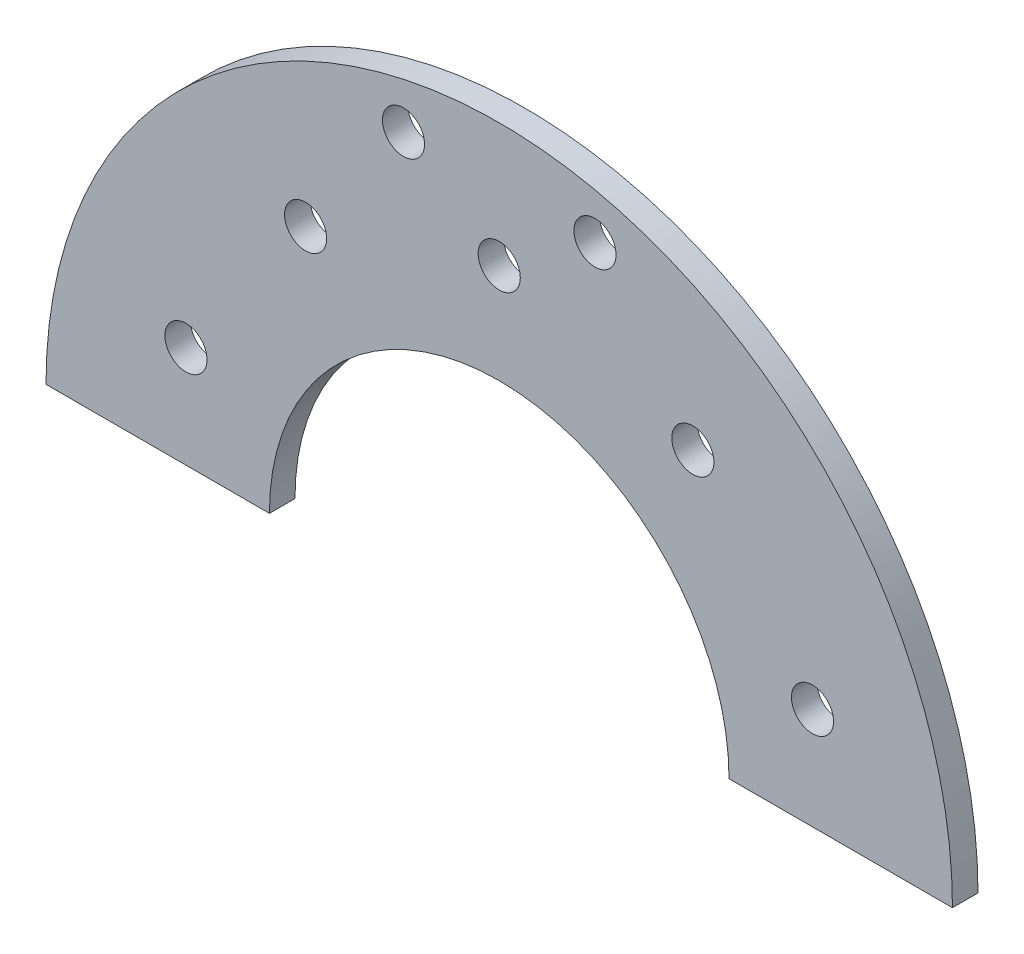
ISO-10303-21;
HEADER;
FILE_DESCRIPTION(('STEP AP214'),'2;1');
FILE_NAME('part.step','',(''),(''),'','','');
FILE_SCHEMA(('AUTOMOTIVE_DESIGN { 1 0 10303 214 1 1 1 1 }'));
ENDSEC;
DATA;
#1=APPLICATION_CONTEXT('core data for automotive mechanical design processes');
#2=APPLICATION_PROTOCOL_DEFINITION('international standard','automotive_design',2000,#1);
#3=PRODUCT_CONTEXT('',#1,'mechanical');
#4=PRODUCT('Part','Part','',(#3));
#5=PRODUCT_RELATED_PRODUCT_CATEGORY('part','',(#4));
#6=PRODUCT_DEFINITION_FORMATION('','',#4);
#7=PRODUCT_DEFINITION_CONTEXT('part definition',#1,'design');
#8=PRODUCT_DEFINITION('design','',#6,#7);
#9=PRODUCT_DEFINITION_SHAPE('','',#8);
#10=(LENGTH_UNIT() NAMED_UNIT(*) SI_UNIT(.MILLI.,.METRE.));
#11=(NAMED_UNIT(*) PLANE_ANGLE_UNIT() SI_UNIT($,.RADIAN.));
#12=(NAMED_UNIT(*) SI_UNIT($,.STERADIAN.) SOLID_ANGLE_UNIT());
#13=UNCERTAINTY_MEASURE_WITH_UNIT(LENGTH_MEASURE(1.E-05),#10,'distance_accuracy_value','');
#14=(GEOMETRIC_REPRESENTATION_CONTEXT(3) GLOBAL_UNCERTAINTY_ASSIGNED_CONTEXT((#13)) GLOBAL_UNIT_ASSIGNED_CONTEXT((#10,
#11,#12)) REPRESENTATION_CONTEXT('',''));
#15=CARTESIAN_POINT('',(0.,0.,0.));
#16=DIRECTION('',(0.,0.,1.));
#17=DIRECTION('',(1.,0.,0.));
#18=AXIS2_PLACEMENT_3D('',#15,#16,#17);
#19=CARTESIAN_POINT('',(0.,0.,0.));
#20=DIRECTION('',(0.,1.,0.));
#21=DIRECTION('',(0.,0.,1.));
#22=AXIS2_PLACEMENT_3D('',#19,#20,#21);
#23=PLANE('',#22);
#24=DIRECTION('',(-1.,0.,0.));
#25=VECTOR('',#24,1.);
#26=CARTESIAN_POINT('',(0.,0.,4.));
#27=LINE('',#26,#25);
#28=CARTESIAN_POINT('',(71.,0.,4.));
#29=VERTEX_POINT('',#28);
#30=CARTESIAN_POINT('',(36.,0.,4.));
#31=VERTEX_POINT('',#30);
#32=EDGE_CURVE('E77',#29,#31,#27,.T.);
#33=ORIENTED_EDGE('',*,*,#32,.T.);
#34=DIRECTION('',(0.,0.,-1.));
#35=VECTOR('',#34,1.);
#36=CARTESIAN_POINT('',(36.,0.,4.));
#37=LINE('',#36,#35);
#38=CARTESIAN_POINT('',(36.,0.,0.));
#39=VERTEX_POINT('',#38);
#40=EDGE_CURVE('E41',#31,#39,#37,.T.);
#41=ORIENTED_EDGE('',*,*,#40,.T.);
#42=DIRECTION('',(-1.,0.,0.));
#43=VECTOR('',#42,1.);
#44=CARTESIAN_POINT('',(0.,0.,0.));
#45=LINE('',#44,#43);
#46=CARTESIAN_POINT('',(71.,0.,0.));
#47=VERTEX_POINT('',#46);
#48=EDGE_CURVE('E78',#47,#39,#45,.T.);
#49=ORIENTED_EDGE('',*,*,#48,.F.);
#50=DIRECTION('',(0.,0.,-1.));
#51=VECTOR('',#50,1.);
#52=CARTESIAN_POINT('',(71.,0.,4.));
#53=LINE('',#52,#51);
#54=EDGE_CURVE('E36',#29,#47,#53,.T.);
#55=ORIENTED_EDGE('',*,*,#54,.F.);
#56=EDGE_LOOP('',(#33,#41,#49,#55));
#57=FACE_BOUND('',#56,.T.);
#58=ADVANCED_FACE('F33',(#57),#23,.F.);
#59=CARTESIAN_POINT('',(-36.,0.,0.));
#60=VERTEX_POINT('',#59);
#61=CARTESIAN_POINT('',(-71.,0.,0.));
#62=VERTEX_POINT('',#61);
#63=EDGE_CURVE('E83',#60,#62,#45,.T.);
#64=ORIENTED_EDGE('',*,*,#63,.F.);
#65=DIRECTION('',(0.,0.,-1.));
#66=VECTOR('',#65,1.);
#67=CARTESIAN_POINT('',(-36.,0.,4.));
#68=LINE('',#67,#66);
#69=CARTESIAN_POINT('',(-36.,0.,4.));
#70=VERTEX_POINT('',#69);
#71=EDGE_CURVE('E11',#60,#70,#68,.F.);
#72=ORIENTED_EDGE('',*,*,#71,.T.);
#73=CARTESIAN_POINT('',(-71.,0.,4.));
#74=VERTEX_POINT('',#73);
#75=EDGE_CURVE('E56',#70,#74,#27,.T.);
#76=ORIENTED_EDGE('',*,*,#75,.T.);
#77=DIRECTION('',(0.,0.,-1.));
#78=VECTOR('',#77,1.);
#79=CARTESIAN_POINT('',(-71.,0.,4.));
#80=LINE('',#79,#78);
#81=EDGE_CURVE('E84',#62,#74,#80,.F.);
#82=ORIENTED_EDGE('',*,*,#81,.F.);
#83=EDGE_LOOP('',(#64,#72,#76,#82));
#84=FACE_BOUND('',#83,.T.);
#85=ADVANCED_FACE('F101',(#84),#23,.F.);
#86=CARTESIAN_POINT('',(0.,0.,4.));
#87=DIRECTION('',(0.,0.,1.));
#88=DIRECTION('',(1.,0.,0.));
#89=AXIS2_PLACEMENT_3D('',#86,#87,#88);
#90=PLANE('',#89);
#91=ORIENTED_EDGE('',*,*,#32,.F.);
#92=CARTESIAN_POINT('',(0.,0.,4.));
#93=DIRECTION('',(0.,0.,1.));
#94=DIRECTION('',(1.,0.,0.));
#95=AXIS2_PLACEMENT_3D('',#92,#93,#94);
#96=CIRCLE('',#95,71.);
#97=EDGE_CURVE('E87',#29,#74,#96,.T.);
#98=ORIENTED_EDGE('',*,*,#97,.T.);
#99=ORIENTED_EDGE('',*,*,#75,.F.);
#100=CARTESIAN_POINT('',(0.,0.,4.));
#101=DIRECTION('',(0.,0.,1.));
#102=DIRECTION('',(1.,0.,0.));
#103=AXIS2_PLACEMENT_3D('',#100,#101,#102);
#104=CIRCLE('',#103,36.);
#105=EDGE_CURVE('E88',#31,#70,#104,.T.);
#106=ORIENTED_EDGE('',*,*,#105,.F.);
#107=EDGE_LOOP('',(#91,#98,#99,#106));
#108=FACE_BOUND('',#107,.T.);
#109=CARTESIAN_POINT('',(-15.,62.2173609212091,4.));
#110=DIRECTION('',(0.,0.,1.));
#111=DIRECTION('',(1.,0.,0.));
#112=AXIS2_PLACEMENT_3D('',#109,#110,#111);
#113=CIRCLE('',#112,3.3);
#114=CARTESIAN_POINT('',(-11.7,62.2173609212091,4.));
#115=VERTEX_POINT('',#114);
#116=EDGE_CURVE('E134',#115,#115,#113,.T.);
#117=ORIENTED_EDGE('',*,*,#116,.F.);
#118=EDGE_LOOP('',(#117));
#119=FACE_BOUND('',#118,.T.);
#120=CARTESIAN_POINT('',(-49.0745162408298,15.9452769097478,4.));
#121=DIRECTION('',(0.,0.,1.));
#122=DIRECTION('',(1.,0.,0.));
#123=AXIS2_PLACEMENT_3D('',#120,#121,#122);
#124=CIRCLE('',#123,3.30000000000029);
#125=CARTESIAN_POINT('',(-45.7745162408295,15.9452769097478,4.));
#126=VERTEX_POINT('',#125);
#127=EDGE_CURVE('E122',#126,#126,#124,.T.);
#128=ORIENTED_EDGE('',*,*,#127,.F.);
#129=EDGE_LOOP('',(#128));
#130=FACE_BOUND('',#129,.T.);
#131=CARTESIAN_POINT('',(49.0745162408302,15.9452769097465,4.));
#132=DIRECTION('',(0.,0.,1.));
#133=DIRECTION('',(1.,0.,0.));
#134=AXIS2_PLACEMENT_3D('',#131,#132,#133);
#135=CIRCLE('',#134,3.3);
#136=CARTESIAN_POINT('',(52.3745162408302,15.9452769097465,4.));
#137=VERTEX_POINT('',#136);
#138=EDGE_CURVE('E116',#137,#137,#135,.T.);
#139=ORIENTED_EDGE('',*,*,#138,.F.);
#140=EDGE_LOOP('',(#139));
#141=FACE_BOUND('',#140,.T.);
#142=CARTESIAN_POINT('',(0.,51.6,4.));
#143=DIRECTION('',(0.,0.,1.));
#144=DIRECTION('',(1.,0.,0.));
#145=AXIS2_PLACEMENT_3D('',#142,#143,#144);
#146=CIRCLE('',#145,3.3);
#147=CARTESIAN_POINT('',(3.3,51.6,4.));
#148=VERTEX_POINT('',#147);
#149=EDGE_CURVE('E105',#148,#148,#146,.T.);
#150=ORIENTED_EDGE('',*,*,#149,.F.);
#151=EDGE_LOOP('',(#150));
#152=FACE_BOUND('',#151,.T.);
#153=CARTESIAN_POINT('',(30.3297190182922,41.7452769097468,4.));
#154=DIRECTION('',(0.,0.,1.));
#155=DIRECTION('',(1.,0.,0.));
#156=AXIS2_PLACEMENT_3D('',#153,#154,#155);
#157=CIRCLE('',#156,3.3);
#158=CARTESIAN_POINT('',(33.6297190182922,41.7452769097468,4.));
#159=VERTEX_POINT('',#158);
#160=EDGE_CURVE('E110',#159,#159,#157,.T.);
#161=ORIENTED_EDGE('',*,*,#160,.F.);
#162=EDGE_LOOP('',(#161));
#163=FACE_BOUND('',#162,.T.);
#164=CARTESIAN_POINT('',(-30.3297190182911,41.7452769097477,4.));
#165=DIRECTION('',(0.,0.,1.));
#166=DIRECTION('',(1.,0.,0.));
#167=AXIS2_PLACEMENT_3D('',#164,#165,#166);
#168=CIRCLE('',#167,3.30000000000001);
#169=CARTESIAN_POINT('',(-27.0297190182911,41.7452769097477,4.));
#170=VERTEX_POINT('',#169);
#171=EDGE_CURVE('E128',#170,#170,#168,.T.);
#172=ORIENTED_EDGE('',*,*,#171,.F.);
#173=EDGE_LOOP('',(#172));
#174=FACE_BOUND('',#173,.T.);
#175=CARTESIAN_POINT('',(15.,62.2173609212091,4.));
#176=DIRECTION('',(0.,0.,1.));
#177=DIRECTION('',(1.,0.,0.));
#178=AXIS2_PLACEMENT_3D('',#175,#176,#177);
#179=CIRCLE('',#178,3.3);
#180=CARTESIAN_POINT('',(18.3,62.2173609212091,4.));
#181=VERTEX_POINT('',#180);
#182=EDGE_CURVE('E140',#181,#181,#179,.T.);
#183=ORIENTED_EDGE('',*,*,#182,.F.);
#184=EDGE_LOOP('',(#183));
#185=FACE_BOUND('',#184,.T.);
#186=ADVANCED_FACE('F85',(#108,#119,#130,#141,#152,#163,#174,#185),#90,.T.);
#187=CARTESIAN_POINT('',(0.,0.,0.));
#188=DIRECTION('',(0.,0.,1.));
#189=DIRECTION('',(1.,0.,0.));
#190=AXIS2_PLACEMENT_3D('',#187,#188,#189);
#191=PLANE('',#190);
#192=CARTESIAN_POINT('',(0.,0.,0.));
#193=DIRECTION('',(0.,0.,1.));
#194=DIRECTION('',(1.,0.,0.));
#195=AXIS2_PLACEMENT_3D('',#192,#193,#194);
#196=CIRCLE('',#195,71.);
#197=EDGE_CURVE('E91',#47,#62,#196,.T.);
#198=ORIENTED_EDGE('',*,*,#197,.F.);
#199=ORIENTED_EDGE('',*,*,#48,.T.);
#200=CARTESIAN_POINT('',(0.,0.,0.));
#201=DIRECTION('',(0.,0.,1.));
#202=DIRECTION('',(1.,0.,0.));
#203=AXIS2_PLACEMENT_3D('',#200,#201,#202);
#204=CIRCLE('',#203,36.);
#205=EDGE_CURVE('E95',#39,#60,#204,.T.);
#206=ORIENTED_EDGE('',*,*,#205,.T.);
#207=ORIENTED_EDGE('',*,*,#63,.T.);
#208=EDGE_LOOP('',(#198,#199,#206,#207));
#209=FACE_BOUND('',#208,.T.);
#210=CARTESIAN_POINT('',(0.,51.6,0.));
#211=DIRECTION('',(0.,0.,1.));
#212=DIRECTION('',(1.,0.,0.));
#213=AXIS2_PLACEMENT_3D('',#210,#211,#212);
#214=CIRCLE('',#213,3.3);
#215=CARTESIAN_POINT('',(3.3,51.6,0.));
#216=VERTEX_POINT('',#215);
#217=EDGE_CURVE('E107',#216,#216,#214,.T.);
#218=ORIENTED_EDGE('',*,*,#217,.T.);
#219=EDGE_LOOP('',(#218));
#220=FACE_BOUND('',#219,.T.);
#221=CARTESIAN_POINT('',(30.3297190182922,41.7452769097468,0.));
#222=DIRECTION('',(0.,0.,1.));
#223=DIRECTION('',(1.,0.,0.));
#224=AXIS2_PLACEMENT_3D('',#221,#222,#223);
#225=CIRCLE('',#224,3.3);
#226=CARTESIAN_POINT('',(33.6297190182922,41.7452769097468,0.));
#227=VERTEX_POINT('',#226);
#228=EDGE_CURVE('E113',#227,#227,#225,.T.);
#229=ORIENTED_EDGE('',*,*,#228,.T.);
#230=EDGE_LOOP('',(#229));
#231=FACE_BOUND('',#230,.T.);
#232=CARTESIAN_POINT('',(49.0745162408302,15.9452769097465,0.));
#233=DIRECTION('',(0.,0.,1.));
#234=DIRECTION('',(1.,0.,0.));
#235=AXIS2_PLACEMENT_3D('',#232,#233,#234);
#236=CIRCLE('',#235,3.3);
#237=CARTESIAN_POINT('',(52.3745162408302,15.9452769097465,0.));
#238=VERTEX_POINT('',#237);
#239=EDGE_CURVE('E119',#238,#238,#236,.T.);
#240=ORIENTED_EDGE('',*,*,#239,.T.);
#241=EDGE_LOOP('',(#240));
#242=FACE_BOUND('',#241,.T.);
#243=CARTESIAN_POINT('',(-49.0745162408298,15.9452769097478,0.));
#244=DIRECTION('',(0.,0.,1.));
#245=DIRECTION('',(1.,0.,0.));
#246=AXIS2_PLACEMENT_3D('',#243,#244,#245);
#247=CIRCLE('',#246,3.30000000000029);
#248=CARTESIAN_POINT('',(-45.7745162408295,15.9452769097478,0.));
#249=VERTEX_POINT('',#248);
#250=EDGE_CURVE('E125',#249,#249,#247,.T.);
#251=ORIENTED_EDGE('',*,*,#250,.T.);
#252=EDGE_LOOP('',(#251));
#253=FACE_BOUND('',#252,.T.);
#254=CARTESIAN_POINT('',(-30.3297190182911,41.7452769097477,0.));
#255=DIRECTION('',(0.,0.,1.));
#256=DIRECTION('',(1.,0.,0.));
#257=AXIS2_PLACEMENT_3D('',#254,#255,#256);
#258=CIRCLE('',#257,3.30000000000001);
#259=CARTESIAN_POINT('',(-27.0297190182911,41.7452769097477,0.));
#260=VERTEX_POINT('',#259);
#261=EDGE_CURVE('E131',#260,#260,#258,.T.);
#262=ORIENTED_EDGE('',*,*,#261,.T.);
#263=EDGE_LOOP('',(#262));
#264=FACE_BOUND('',#263,.T.);
#265=CARTESIAN_POINT('',(-15.,62.2173609212091,0.));
#266=DIRECTION('',(0.,0.,1.));
#267=DIRECTION('',(1.,0.,0.));
#268=AXIS2_PLACEMENT_3D('',#265,#266,#267);
#269=CIRCLE('',#268,3.3);
#270=CARTESIAN_POINT('',(-11.7,62.2173609212091,0.));
#271=VERTEX_POINT('',#270);
#272=EDGE_CURVE('E137',#271,#271,#269,.T.);
#273=ORIENTED_EDGE('',*,*,#272,.T.);
#274=EDGE_LOOP('',(#273));
#275=FACE_BOUND('',#274,.T.);
#276=CARTESIAN_POINT('',(15.,62.2173609212091,0.));
#277=DIRECTION('',(0.,0.,1.));
#278=DIRECTION('',(1.,0.,0.));
#279=AXIS2_PLACEMENT_3D('',#276,#277,#278);
#280=CIRCLE('',#279,3.3);
#281=CARTESIAN_POINT('',(18.3,62.2173609212091,0.));
#282=VERTEX_POINT('',#281);
#283=EDGE_CURVE('E143',#282,#282,#280,.T.);
#284=ORIENTED_EDGE('',*,*,#283,.T.);
#285=EDGE_LOOP('',(#284));
#286=FACE_BOUND('',#285,.T.);
#287=ADVANCED_FACE('F153',(#209,#220,#231,#242,#253,#264,#275,#286),#191,.F.);
#288=CARTESIAN_POINT('',(0.,0.,4.));
#289=DIRECTION('',(0.,0.,-1.));
#290=DIRECTION('',(-1.,0.,0.));
#291=AXIS2_PLACEMENT_3D('',#288,#289,#290);
#292=CYLINDRICAL_SURFACE('',#291,71.);
#293=ORIENTED_EDGE('',*,*,#97,.F.);
#294=ORIENTED_EDGE('',*,*,#54,.T.);
#295=ORIENTED_EDGE('',*,*,#197,.T.);
#296=ORIENTED_EDGE('',*,*,#81,.T.);
#297=EDGE_LOOP('',(#293,#294,#295,#296));
#298=FACE_BOUND('',#297,.T.);
#299=ADVANCED_FACE('F90',(#298),#292,.T.);
#300=CARTESIAN_POINT('',(0.,0.,4.));
#301=DIRECTION('',(0.,0.,-1.));
#302=DIRECTION('',(-1.,0.,0.));
#303=AXIS2_PLACEMENT_3D('',#300,#301,#302);
#304=CYLINDRICAL_SURFACE('',#303,36.);
#305=ORIENTED_EDGE('',*,*,#40,.F.);
#306=ORIENTED_EDGE('',*,*,#105,.T.);
#307=ORIENTED_EDGE('',*,*,#71,.F.);
#308=ORIENTED_EDGE('',*,*,#205,.F.);
#309=EDGE_LOOP('',(#305,#306,#307,#308));
#310=FACE_BOUND('',#309,.T.);
#311=ADVANCED_FACE('F104',(#310),#304,.F.);
#312=CARTESIAN_POINT('',(0.,51.6,4.));
#313=DIRECTION('',(0.,0.,-1.));
#314=DIRECTION('',(-1.,0.,0.));
#315=AXIS2_PLACEMENT_3D('',#312,#313,#314);
#316=CYLINDRICAL_SURFACE('',#315,3.3);
#317=ORIENTED_EDGE('',*,*,#149,.T.);
#318=EDGE_LOOP('',(#317));
#319=FACE_BOUND('',#318,.T.);
#320=ORIENTED_EDGE('',*,*,#217,.F.);
#321=EDGE_LOOP('',(#320));
#322=FACE_BOUND('',#321,.T.);
#323=ADVANCED_FACE('F195',(#319,#322),#316,.F.);
#324=CARTESIAN_POINT('',(30.3297190182922,41.7452769097468,4.));
#325=DIRECTION('',(0.,0.,-1.));
#326=DIRECTION('',(-1.,0.,0.));
#327=AXIS2_PLACEMENT_3D('',#324,#325,#326);
#328=CYLINDRICAL_SURFACE('',#327,3.3);
#329=ORIENTED_EDGE('',*,*,#160,.T.);
#330=EDGE_LOOP('',(#329));
#331=FACE_BOUND('',#330,.T.);
#332=ORIENTED_EDGE('',*,*,#228,.F.);
#333=EDGE_LOOP('',(#332));
#334=FACE_BOUND('',#333,.T.);
#335=ADVANCED_FACE('F203',(#331,#334),#328,.F.);
#336=CARTESIAN_POINT('',(49.0745162408302,15.9452769097465,4.));
#337=DIRECTION('',(0.,0.,-1.));
#338=DIRECTION('',(-1.,0.,0.));
#339=AXIS2_PLACEMENT_3D('',#336,#337,#338);
#340=CYLINDRICAL_SURFACE('',#339,3.3);
#341=ORIENTED_EDGE('',*,*,#138,.T.);
#342=EDGE_LOOP('',(#341));
#343=FACE_BOUND('',#342,.T.);
#344=ORIENTED_EDGE('',*,*,#239,.F.);
#345=EDGE_LOOP('',(#344));
#346=FACE_BOUND('',#345,.T.);
#347=ADVANCED_FACE('F211',(#343,#346),#340,.F.);
#348=CARTESIAN_POINT('',(-49.0745162408298,15.9452769097478,4.));
#349=DIRECTION('',(0.,0.,-1.));
#350=DIRECTION('',(-1.,0.,0.));
#351=AXIS2_PLACEMENT_3D('',#348,#349,#350);
#352=CYLINDRICAL_SURFACE('',#351,3.30000000000029);
#353=ORIENTED_EDGE('',*,*,#127,.T.);
#354=EDGE_LOOP('',(#353));
#355=FACE_BOUND('',#354,.T.);
#356=ORIENTED_EDGE('',*,*,#250,.F.);
#357=EDGE_LOOP('',(#356));
#358=FACE_BOUND('',#357,.T.);
#359=ADVANCED_FACE('F220',(#355,#358),#352,.F.);
#360=CARTESIAN_POINT('',(-30.3297190182911,41.7452769097477,4.));
#361=DIRECTION('',(0.,0.,-1.));
#362=DIRECTION('',(-1.,0.,0.));
#363=AXIS2_PLACEMENT_3D('',#360,#361,#362);
#364=CYLINDRICAL_SURFACE('',#363,3.30000000000001);
#365=ORIENTED_EDGE('',*,*,#171,.T.);
#366=EDGE_LOOP('',(#365));
#367=FACE_BOUND('',#366,.T.);
#368=ORIENTED_EDGE('',*,*,#261,.F.);
#369=EDGE_LOOP('',(#368));
#370=FACE_BOUND('',#369,.T.);
#371=ADVANCED_FACE('F229',(#367,#370),#364,.F.);
#372=CARTESIAN_POINT('',(-15.,62.2173609212091,4.));
#373=DIRECTION('',(0.,0.,-1.));
#374=DIRECTION('',(-1.,0.,0.));
#375=AXIS2_PLACEMENT_3D('',#372,#373,#374);
#376=CYLINDRICAL_SURFACE('',#375,3.3);
#377=ORIENTED_EDGE('',*,*,#116,.T.);
#378=EDGE_LOOP('',(#377));
#379=FACE_BOUND('',#378,.T.);
#380=ORIENTED_EDGE('',*,*,#272,.F.);
#381=EDGE_LOOP('',(#380));
#382=FACE_BOUND('',#381,.T.);
#383=ADVANCED_FACE('F238',(#379,#382),#376,.F.);
#384=CARTESIAN_POINT('',(15.,62.2173609212091,4.));
#385=DIRECTION('',(0.,0.,-1.));
#386=DIRECTION('',(-1.,0.,0.));
#387=AXIS2_PLACEMENT_3D('',#384,#385,#386);
#388=CYLINDRICAL_SURFACE('',#387,3.3);
#389=ORIENTED_EDGE('',*,*,#182,.T.);
#390=EDGE_LOOP('',(#389));
#391=FACE_BOUND('',#390,.T.);
#392=ORIENTED_EDGE('',*,*,#283,.F.);
#393=EDGE_LOOP('',(#392));
#394=FACE_BOUND('',#393,.T.);
#395=ADVANCED_FACE('F149',(#391,#394),#388,.F.);
#396=CLOSED_SHELL('',(#58,#85,#186,#287,#299,#311,#323,#335,#347,#359,#371,#383,#395));
#397=MANIFOLD_SOLID_BREP('B2',#396);
#398=ADVANCED_BREP_SHAPE_REPRESENTATION('',(#18,#397),#14);
#399=SHAPE_DEFINITION_REPRESENTATION(#9,#398);
ENDSEC;
END-ISO-10303-21;
